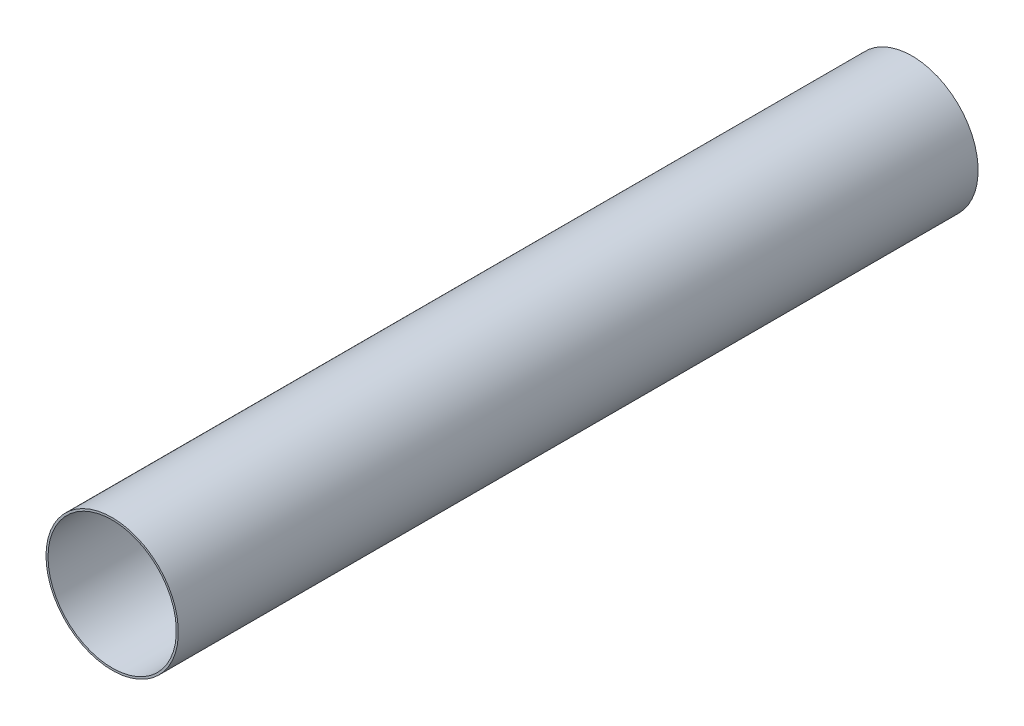
ISO-10303-21;
HEADER;
FILE_DESCRIPTION(('STEP AP214'),'2;1');
FILE_NAME('part.step','',(''),(''),'','','');
FILE_SCHEMA(('AUTOMOTIVE_DESIGN { 1 0 10303 214 1 1 1 1 }'));
ENDSEC;
DATA;
#1=APPLICATION_CONTEXT('core data for automotive mechanical design processes');
#2=APPLICATION_PROTOCOL_DEFINITION('international standard','automotive_design',2000,#1);
#3=PRODUCT_CONTEXT('',#1,'mechanical');
#4=PRODUCT('Part','Part','',(#3));
#5=PRODUCT_RELATED_PRODUCT_CATEGORY('part','',(#4));
#6=PRODUCT_DEFINITION_FORMATION('','',#4);
#7=PRODUCT_DEFINITION_CONTEXT('part definition',#1,'design');
#8=PRODUCT_DEFINITION('design','',#6,#7);
#9=PRODUCT_DEFINITION_SHAPE('','',#8);
#10=(LENGTH_UNIT() NAMED_UNIT(*) SI_UNIT(.MILLI.,.METRE.));
#11=(NAMED_UNIT(*) PLANE_ANGLE_UNIT() SI_UNIT($,.RADIAN.));
#12=(NAMED_UNIT(*) SI_UNIT($,.STERADIAN.) SOLID_ANGLE_UNIT());
#13=UNCERTAINTY_MEASURE_WITH_UNIT(LENGTH_MEASURE(1.E-05),#10,'distance_accuracy_value','');
#14=(GEOMETRIC_REPRESENTATION_CONTEXT(3) GLOBAL_UNCERTAINTY_ASSIGNED_CONTEXT((#13)) GLOBAL_UNIT_ASSIGNED_CONTEXT((#10,
#11,#12)) REPRESENTATION_CONTEXT('',''));
#15=CARTESIAN_POINT('',(0.,0.,0.));
#16=DIRECTION('',(0.,0.,1.));
#17=DIRECTION('',(1.,0.,0.));
#18=AXIS2_PLACEMENT_3D('',#15,#16,#17);
#19=CARTESIAN_POINT('',(0.,0.,950.));
#20=DIRECTION('',(0.,0.,1.));
#21=DIRECTION('',(1.,0.,0.));
#22=AXIS2_PLACEMENT_3D('',#19,#20,#21);
#23=PLANE('',#22);
#24=CARTESIAN_POINT('',(0.,0.,950.));
#25=DIRECTION('',(0.,0.,1.));
#26=DIRECTION('',(1.,0.,0.));
#27=AXIS2_PLACEMENT_3D('',#24,#25,#26);
#28=CIRCLE('',#27,78.6);
#29=CARTESIAN_POINT('',(-78.6,0.,950.));
#30=VERTEX_POINT('',#29);
#31=EDGE_CURVE('E10',#30,#30,#28,.T.);
#32=ORIENTED_EDGE('',*,*,#31,.T.);
#33=EDGE_LOOP('',(#32));
#34=FACE_BOUND('',#33,.T.);
#35=CARTESIAN_POINT('',(0.,0.,950.));
#36=DIRECTION('',(0.,0.,1.));
#37=DIRECTION('',(1.,0.,0.));
#38=AXIS2_PLACEMENT_3D('',#35,#36,#37);
#39=CIRCLE('',#38,76.2);
#40=CARTESIAN_POINT('',(-76.2,0.,950.));
#41=VERTEX_POINT('',#40);
#42=EDGE_CURVE('E43',#41,#41,#39,.T.);
#43=ORIENTED_EDGE('',*,*,#42,.F.);
#44=EDGE_LOOP('',(#43));
#45=FACE_BOUND('',#44,.T.);
#46=ADVANCED_FACE('F32',(#34,#45),#23,.T.);
#47=CARTESIAN_POINT('',(0.,0.,0.));
#48=DIRECTION('',(0.,0.,1.));
#49=DIRECTION('',(1.,0.,0.));
#50=AXIS2_PLACEMENT_3D('',#47,#48,#49);
#51=PLANE('',#50);
#52=CARTESIAN_POINT('',(0.,0.,0.));
#53=DIRECTION('',(0.,0.,1.));
#54=DIRECTION('',(1.,0.,0.));
#55=AXIS2_PLACEMENT_3D('',#52,#53,#54);
#56=CIRCLE('',#55,78.6);
#57=CARTESIAN_POINT('',(-78.6,0.,-1.11022302462516E-13));
#58=VERTEX_POINT('',#57);
#59=EDGE_CURVE('E36',#58,#58,#56,.T.);
#60=ORIENTED_EDGE('',*,*,#59,.F.);
#61=EDGE_LOOP('',(#60));
#62=FACE_BOUND('',#61,.T.);
#63=CARTESIAN_POINT('',(0.,0.,0.));
#64=DIRECTION('',(0.,0.,1.));
#65=DIRECTION('',(1.,0.,0.));
#66=AXIS2_PLACEMENT_3D('',#63,#64,#65);
#67=CIRCLE('',#66,76.2);
#68=CARTESIAN_POINT('',(-76.2,0.,-1.11022302462516E-13));
#69=VERTEX_POINT('',#68);
#70=EDGE_CURVE('E45',#69,#69,#67,.T.);
#71=ORIENTED_EDGE('',*,*,#70,.T.);
#72=EDGE_LOOP('',(#71));
#73=FACE_BOUND('',#72,.T.);
#74=ADVANCED_FACE('F55',(#62,#73),#51,.F.);
#75=CARTESIAN_POINT('',(0.,0.,950.));
#76=DIRECTION('',(0.,0.,-1.));
#77=DIRECTION('',(-1.,0.,0.));
#78=AXIS2_PLACEMENT_3D('',#75,#76,#77);
#79=CYLINDRICAL_SURFACE('',#78,78.6);
#80=CARTESIAN_POINT('',(-78.6,0.,950.));
#81=CARTESIAN_POINT('',(-78.6,0.,940.104166666667));
#82=CARTESIAN_POINT('',(-78.6,0.,930.208333333333));
#83=CARTESIAN_POINT('',(-78.6,0.,910.416666666667));
#84=CARTESIAN_POINT('',(-78.6,0.,900.520833333333));
#85=CARTESIAN_POINT('',(-78.6,0.,880.729166666667));
#86=CARTESIAN_POINT('',(-78.6,0.,870.833333333333));
#87=CARTESIAN_POINT('',(-78.6,0.,851.041666666667));
#88=CARTESIAN_POINT('',(-78.6,0.,841.145833333333));
#89=CARTESIAN_POINT('',(-78.6,0.,821.354166666667));
#90=CARTESIAN_POINT('',(-78.6,0.,811.458333333333));
#91=CARTESIAN_POINT('',(-78.6,0.,791.666666666667));
#92=CARTESIAN_POINT('',(-78.6,0.,781.770833333333));
#93=CARTESIAN_POINT('',(-78.6,0.,761.979166666667));
#94=CARTESIAN_POINT('',(-78.6,0.,752.083333333333));
#95=CARTESIAN_POINT('',(-78.6,0.,732.291666666667));
#96=CARTESIAN_POINT('',(-78.6,0.,722.395833333333));
#97=CARTESIAN_POINT('',(-78.6,0.,702.604166666667));
#98=CARTESIAN_POINT('',(-78.6,0.,692.708333333333));
#99=CARTESIAN_POINT('',(-78.6,0.,672.916666666667));
#100=CARTESIAN_POINT('',(-78.6,0.,663.020833333333));
#101=CARTESIAN_POINT('',(-78.6,0.,643.229166666667));
#102=CARTESIAN_POINT('',(-78.6,0.,633.333333333333));
#103=CARTESIAN_POINT('',(-78.6,0.,613.541666666667));
#104=CARTESIAN_POINT('',(-78.6,0.,603.645833333333));
#105=CARTESIAN_POINT('',(-78.6,0.,583.854166666667));
#106=CARTESIAN_POINT('',(-78.6,0.,573.958333333333));
#107=CARTESIAN_POINT('',(-78.6,0.,554.166666666667));
#108=CARTESIAN_POINT('',(-78.6,0.,544.270833333333));
#109=CARTESIAN_POINT('',(-78.6,0.,524.479166666667));
#110=CARTESIAN_POINT('',(-78.6,0.,514.583333333333));
#111=CARTESIAN_POINT('',(-78.6,0.,494.791666666667));
#112=CARTESIAN_POINT('',(-78.6,0.,484.895833333333));
#113=CARTESIAN_POINT('',(-78.6,0.,465.104166666667));
#114=CARTESIAN_POINT('',(-78.6,0.,455.208333333333));
#115=CARTESIAN_POINT('',(-78.6,0.,435.416666666667));
#116=CARTESIAN_POINT('',(-78.6,0.,425.520833333333));
#117=CARTESIAN_POINT('',(-78.6,0.,405.729166666667));
#118=CARTESIAN_POINT('',(-78.6,0.,395.833333333333));
#119=CARTESIAN_POINT('',(-78.6,0.,376.041666666667));
#120=CARTESIAN_POINT('',(-78.6,0.,366.145833333333));
#121=CARTESIAN_POINT('',(-78.6,0.,346.354166666667));
#122=CARTESIAN_POINT('',(-78.6,0.,336.458333333333));
#123=CARTESIAN_POINT('',(-78.6,0.,316.666666666667));
#124=CARTESIAN_POINT('',(-78.6,0.,306.770833333333));
#125=CARTESIAN_POINT('',(-78.6,0.,286.979166666667));
#126=CARTESIAN_POINT('',(-78.6,0.,277.083333333333));
#127=CARTESIAN_POINT('',(-78.6,0.,257.291666666667));
#128=CARTESIAN_POINT('',(-78.6,0.,247.395833333333));
#129=CARTESIAN_POINT('',(-78.6,0.,227.604166666667));
#130=CARTESIAN_POINT('',(-78.6,0.,217.708333333333));
#131=CARTESIAN_POINT('',(-78.6,0.,197.916666666667));
#132=CARTESIAN_POINT('',(-78.6,0.,188.020833333333));
#133=CARTESIAN_POINT('',(-78.6,0.,168.229166666667));
#134=CARTESIAN_POINT('',(-78.6,0.,158.333333333333));
#135=CARTESIAN_POINT('',(-78.6,0.,138.541666666667));
#136=CARTESIAN_POINT('',(-78.6,0.,128.645833333333));
#137=CARTESIAN_POINT('',(-78.6,0.,108.854166666667));
#138=CARTESIAN_POINT('',(-78.6,0.,98.9583333333333));
#139=CARTESIAN_POINT('',(-78.6,0.,79.1666666666666));
#140=CARTESIAN_POINT('',(-78.6,0.,69.2708333333332));
#141=CARTESIAN_POINT('',(-78.6,0.,49.4791666666665));
#142=CARTESIAN_POINT('',(-78.6,0.,39.5833333333332));
#143=CARTESIAN_POINT('',(-78.6,0.,19.7916666666665));
#144=CARTESIAN_POINT('',(-78.6,0.,9.89583333333321));
#145=CARTESIAN_POINT('',(-78.6,0.,-1.11022302462516E-13));
#146=B_SPLINE_CURVE_WITH_KNOTS('',3,(#80,#81,#82,#83,#84,#85,#86,#87,#88,#89,#90,#91,#92,#93,
#94,#95,#96,#97,#98,#99,#100,#101,#102,#103,#104,#105,#106,#107,#108,#109,#110,#111,#112,#113,
#114,#115,#116,#117,#118,#119,#120,#121,#122,#123,#124,#125,#126,#127,#128,#129,#130,#131,#132,
#133,#134,#135,#136,#137,#138,#139,#140,#141,#142,#143,#144,#145),.UNSPECIFIED.,.F.,.F.,(4,2,2,
2,2,2,2,2,2,2,2,2,2,2,2,2,2,2,2,2,2,2,2,2,2,2,2,2,2,2,2,2,4),(0.,29.6875,59.375,
89.0624999999999,118.75,148.4375,178.125,207.8125,237.5,267.1875,296.875,326.5625,356.25,
385.9375,415.625,445.3125,475.,504.6875,534.375,564.0625,593.75,623.4375,653.125,682.8125,712.5,
742.1875,771.875,801.5625,831.25,860.9375,890.625,920.3125,950.),.UNSPECIFIED.);
#147=EDGE_CURVE('BSEAM34',#30,#58,#146,.T.);
#148=ORIENTED_EDGE('',*,*,#31,.F.);
#149=ORIENTED_EDGE('',*,*,#59,.T.);
#150=ORIENTED_EDGE('',*,*,#147,.T.);
#151=ORIENTED_EDGE('',*,*,#147,.F.);
#152=EDGE_LOOP('',(#148,#150,#149,#151));
#153=FACE_BOUND('',#152,.T.);
#154=ADVANCED_FACE('F34',(#153),#79,.T.);
#155=CARTESIAN_POINT('',(0.,0.,950.));
#156=DIRECTION('',(0.,0.,-1.));
#157=DIRECTION('',(-1.,0.,0.));
#158=AXIS2_PLACEMENT_3D('',#155,#156,#157);
#159=CYLINDRICAL_SURFACE('',#158,76.2);
#160=CARTESIAN_POINT('',(-76.2,0.,950.));
#161=CARTESIAN_POINT('',(-76.2,0.,940.104166666667));
#162=CARTESIAN_POINT('',(-76.2,0.,930.208333333333));
#163=CARTESIAN_POINT('',(-76.2,0.,910.416666666667));
#164=CARTESIAN_POINT('',(-76.2,0.,900.520833333333));
#165=CARTESIAN_POINT('',(-76.2,0.,880.729166666667));
#166=CARTESIAN_POINT('',(-76.2,0.,870.833333333333));
#167=CARTESIAN_POINT('',(-76.2,0.,851.041666666667));
#168=CARTESIAN_POINT('',(-76.2,0.,841.145833333333));
#169=CARTESIAN_POINT('',(-76.2,0.,821.354166666667));
#170=CARTESIAN_POINT('',(-76.2,0.,811.458333333333));
#171=CARTESIAN_POINT('',(-76.2,0.,791.666666666667));
#172=CARTESIAN_POINT('',(-76.2,0.,781.770833333333));
#173=CARTESIAN_POINT('',(-76.2,0.,761.979166666667));
#174=CARTESIAN_POINT('',(-76.2,0.,752.083333333333));
#175=CARTESIAN_POINT('',(-76.2,0.,732.291666666667));
#176=CARTESIAN_POINT('',(-76.2,0.,722.395833333333));
#177=CARTESIAN_POINT('',(-76.2,0.,702.604166666667));
#178=CARTESIAN_POINT('',(-76.2,0.,692.708333333333));
#179=CARTESIAN_POINT('',(-76.2,0.,672.916666666667));
#180=CARTESIAN_POINT('',(-76.2,0.,663.020833333333));
#181=CARTESIAN_POINT('',(-76.2,0.,643.229166666667));
#182=CARTESIAN_POINT('',(-76.2,0.,633.333333333333));
#183=CARTESIAN_POINT('',(-76.2,0.,613.541666666667));
#184=CARTESIAN_POINT('',(-76.2,0.,603.645833333333));
#185=CARTESIAN_POINT('',(-76.2,0.,583.854166666667));
#186=CARTESIAN_POINT('',(-76.2,0.,573.958333333333));
#187=CARTESIAN_POINT('',(-76.2,0.,554.166666666667));
#188=CARTESIAN_POINT('',(-76.2,0.,544.270833333333));
#189=CARTESIAN_POINT('',(-76.2,0.,524.479166666667));
#190=CARTESIAN_POINT('',(-76.2,0.,514.583333333333));
#191=CARTESIAN_POINT('',(-76.2,0.,494.791666666667));
#192=CARTESIAN_POINT('',(-76.2,0.,484.895833333333));
#193=CARTESIAN_POINT('',(-76.2,0.,465.104166666667));
#194=CARTESIAN_POINT('',(-76.2,0.,455.208333333333));
#195=CARTESIAN_POINT('',(-76.2,0.,435.416666666667));
#196=CARTESIAN_POINT('',(-76.2,0.,425.520833333333));
#197=CARTESIAN_POINT('',(-76.2,0.,405.729166666667));
#198=CARTESIAN_POINT('',(-76.2,0.,395.833333333333));
#199=CARTESIAN_POINT('',(-76.2,0.,376.041666666667));
#200=CARTESIAN_POINT('',(-76.2,0.,366.145833333333));
#201=CARTESIAN_POINT('',(-76.2,0.,346.354166666667));
#202=CARTESIAN_POINT('',(-76.2,0.,336.458333333333));
#203=CARTESIAN_POINT('',(-76.2,0.,316.666666666667));
#204=CARTESIAN_POINT('',(-76.2,0.,306.770833333333));
#205=CARTESIAN_POINT('',(-76.2,0.,286.979166666667));
#206=CARTESIAN_POINT('',(-76.2,0.,277.083333333333));
#207=CARTESIAN_POINT('',(-76.2,0.,257.291666666667));
#208=CARTESIAN_POINT('',(-76.2,0.,247.395833333333));
#209=CARTESIAN_POINT('',(-76.2,0.,227.604166666667));
#210=CARTESIAN_POINT('',(-76.2,0.,217.708333333333));
#211=CARTESIAN_POINT('',(-76.2,0.,197.916666666667));
#212=CARTESIAN_POINT('',(-76.2,0.,188.020833333333));
#213=CARTESIAN_POINT('',(-76.2,0.,168.229166666667));
#214=CARTESIAN_POINT('',(-76.2,0.,158.333333333333));
#215=CARTESIAN_POINT('',(-76.2,0.,138.541666666667));
#216=CARTESIAN_POINT('',(-76.2,0.,128.645833333333));
#217=CARTESIAN_POINT('',(-76.2,0.,108.854166666667));
#218=CARTESIAN_POINT('',(-76.2,0.,98.9583333333333));
#219=CARTESIAN_POINT('',(-76.2,0.,79.1666666666666));
#220=CARTESIAN_POINT('',(-76.2,0.,69.2708333333332));
#221=CARTESIAN_POINT('',(-76.2,0.,49.4791666666665));
#222=CARTESIAN_POINT('',(-76.2,0.,39.5833333333332));
#223=CARTESIAN_POINT('',(-76.2,0.,19.7916666666665));
#224=CARTESIAN_POINT('',(-76.2,0.,9.89583333333321));
#225=CARTESIAN_POINT('',(-76.2,0.,-1.11022302462516E-13));
#226=B_SPLINE_CURVE_WITH_KNOTS('',3,(#160,#161,#162,#163,#164,#165,#166,#167,#168,#169,#170,
#171,#172,#173,#174,#175,#176,#177,#178,#179,#180,#181,#182,#183,#184,#185,#186,#187,#188,#189,
#190,#191,#192,#193,#194,#195,#196,#197,#198,#199,#200,#201,#202,#203,#204,#205,#206,#207,#208,
#209,#210,#211,#212,#213,#214,#215,#216,#217,#218,#219,#220,#221,#222,#223,#224,#225),
.UNSPECIFIED.,.F.,.F.,(4,2,2,2,2,2,2,2,2,2,2,2,2,2,2,2,2,2,2,2,2,2,2,2,2,2,2,2,2,2,2,2,4),(0.,
29.6875,59.375,89.0624999999999,118.75,148.4375,178.125,207.8125,237.5,267.1875,296.875,
326.5625,356.25,385.9375,415.625,445.3125,475.,504.6875,534.375,564.0625,593.75,623.4375,
653.125,682.8125,712.5,742.1875,771.875,801.5625,831.25,860.9375,890.625,920.3125,950.),.UNSPECIFIED.);
#227=EDGE_CURVE('BSEAM51',#41,#69,#226,.T.);
#228=ORIENTED_EDGE('',*,*,#42,.T.);
#229=ORIENTED_EDGE('',*,*,#70,.F.);
#230=ORIENTED_EDGE('',*,*,#227,.T.);
#231=ORIENTED_EDGE('',*,*,#227,.F.);
#232=EDGE_LOOP('',(#228,#230,#229,#231));
#233=FACE_BOUND('',#232,.T.);
#234=ADVANCED_FACE('F51',(#233),#159,.F.);
#235=CLOSED_SHELL('',(#46,#74,#154,#234));
#236=MANIFOLD_SOLID_BREP('B2',#235);
#237=ADVANCED_BREP_SHAPE_REPRESENTATION('',(#18,#236),#14);
#238=SHAPE_DEFINITION_REPRESENTATION(#9,#237);
ENDSEC;
END-ISO-10303-21;
